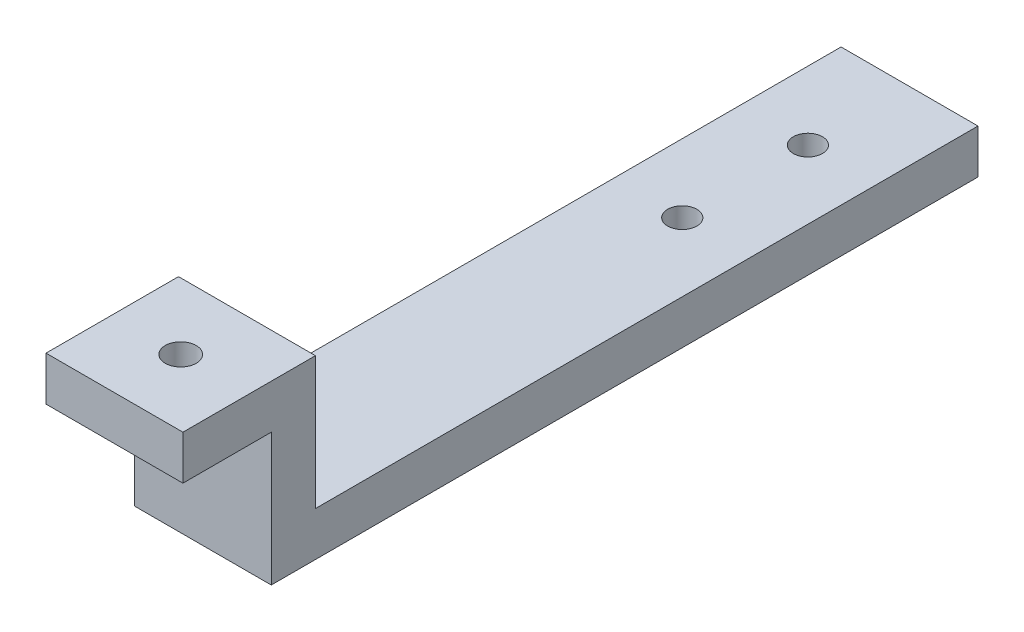
ISO-10303-21;
HEADER;
FILE_DESCRIPTION(('STEP AP214'),'2;1');
FILE_NAME('part.step','',(''),(''),'','','');
FILE_SCHEMA(('AUTOMOTIVE_DESIGN { 1 0 10303 214 1 1 1 1 }'));
ENDSEC;
DATA;
#1=APPLICATION_CONTEXT('core data for automotive mechanical design processes');
#2=APPLICATION_PROTOCOL_DEFINITION('international standard','automotive_design',2000,#1);
#3=PRODUCT_CONTEXT('',#1,'mechanical');
#4=PRODUCT('Part','Part','',(#3));
#5=PRODUCT_RELATED_PRODUCT_CATEGORY('part','',(#4));
#6=PRODUCT_DEFINITION_FORMATION('','',#4);
#7=PRODUCT_DEFINITION_CONTEXT('part definition',#1,'design');
#8=PRODUCT_DEFINITION('design','',#6,#7);
#9=PRODUCT_DEFINITION_SHAPE('','',#8);
#10=(LENGTH_UNIT() NAMED_UNIT(*) SI_UNIT(.MILLI.,.METRE.));
#11=(NAMED_UNIT(*) PLANE_ANGLE_UNIT() SI_UNIT($,.RADIAN.));
#12=(NAMED_UNIT(*) SI_UNIT($,.STERADIAN.) SOLID_ANGLE_UNIT());
#13=UNCERTAINTY_MEASURE_WITH_UNIT(LENGTH_MEASURE(1.E-05),#10,'distance_accuracy_value','');
#14=(GEOMETRIC_REPRESENTATION_CONTEXT(3) GLOBAL_UNCERTAINTY_ASSIGNED_CONTEXT((#13)) GLOBAL_UNIT_ASSIGNED_CONTEXT((#10,
#11,#12)) REPRESENTATION_CONTEXT('',''));
#15=CARTESIAN_POINT('',(0.,0.,0.));
#16=DIRECTION('',(0.,0.,1.));
#17=DIRECTION('',(1.,0.,0.));
#18=AXIS2_PLACEMENT_3D('',#15,#16,#17);
#19=CARTESIAN_POINT('',(31.,-39.9719999999999,-30.));
#20=DIRECTION('',(0.,1.,0.));
#21=DIRECTION('',(0.,0.,1.));
#22=AXIS2_PLACEMENT_3D('',#19,#20,#21);
#23=PLANE('',#22);
#24=CARTESIAN_POINT('',(15.494,-39.9719999999999,-128.552));
#25=DIRECTION('',(0.,1.,0.));
#26=DIRECTION('',(0.,0.,1.));
#27=AXIS2_PLACEMENT_3D('',#24,#25,#26);
#28=CIRCLE('',#27,3.302);
#29=CARTESIAN_POINT('',(15.494,-39.9719999999999,-125.25));
#30=VERTEX_POINT('',#29);
#31=EDGE_CURVE('E40',#30,#30,#28,.T.);
#32=ORIENTED_EDGE('',*,*,#31,.T.);
#33=EDGE_LOOP('',(#32));
#34=FACE_BOUND('',#33,.T.);
#35=CARTESIAN_POINT('',(15.494,-39.9720000000001,-157.));
#36=DIRECTION('',(0.,1.,0.));
#37=DIRECTION('',(0.,0.,1.));
#38=AXIS2_PLACEMENT_3D('',#35,#36,#37);
#39=CIRCLE('',#38,3.30199999999998);
#40=CARTESIAN_POINT('',(15.494,-39.9720000000001,-153.698));
#41=VERTEX_POINT('',#40);
#42=EDGE_CURVE('E187',#41,#41,#39,.T.);
#43=ORIENTED_EDGE('',*,*,#42,.T.);
#44=EDGE_LOOP('',(#43));
#45=FACE_BOUND('',#44,.T.);
#46=DIRECTION('',(0.,0.,-1.));
#47=VECTOR('',#46,1.);
#48=CARTESIAN_POINT('',(0.,-39.9719999999999,-30.));
#49=LINE('',#48,#47);
#50=CARTESIAN_POINT('',(0.,-39.9719999999999,-20.));
#51=VERTEX_POINT('',#50);
#52=CARTESIAN_POINT('',(0.,-39.9720000000001,-180.));
#53=VERTEX_POINT('',#52);
#54=EDGE_CURVE('E135',#51,#53,#49,.T.);
#55=ORIENTED_EDGE('',*,*,#54,.T.);
#56=DIRECTION('',(-1.,0.,0.));
#57=VECTOR('',#56,1.);
#58=CARTESIAN_POINT('',(31.,-39.9720000000001,-180.));
#59=LINE('',#58,#57);
#60=CARTESIAN_POINT('',(31.,-39.9720000000001,-180.));
#61=VERTEX_POINT('',#60);
#62=EDGE_CURVE('E11',#61,#53,#59,.T.);
#63=ORIENTED_EDGE('',*,*,#62,.F.);
#64=DIRECTION('',(0.,0.,-1.));
#65=VECTOR('',#64,1.);
#66=CARTESIAN_POINT('',(31.,-39.9719999999999,-30.));
#67=LINE('',#66,#65);
#68=CARTESIAN_POINT('',(31.,-39.9719999999999,-20.));
#69=VERTEX_POINT('',#68);
#70=EDGE_CURVE('E93',#69,#61,#67,.T.);
#71=ORIENTED_EDGE('',*,*,#70,.F.);
#72=DIRECTION('',(-1.,0.,0.));
#73=VECTOR('',#72,1.);
#74=CARTESIAN_POINT('',(31.,-39.9719999999999,-20.));
#75=LINE('',#74,#73);
#76=EDGE_CURVE('E134',#69,#51,#75,.T.);
#77=ORIENTED_EDGE('',*,*,#76,.T.);
#78=EDGE_LOOP('',(#55,#63,#71,#77));
#79=FACE_BOUND('',#78,.T.);
#80=ADVANCED_FACE('F37',(#34,#45,#79),#23,.F.);
#81=CARTESIAN_POINT('',(31.,-29.9720000000001,-180.));
#82=DIRECTION('',(0.,0.,-1.));
#83=DIRECTION('',(-1.,0.,0.));
#84=AXIS2_PLACEMENT_3D('',#81,#82,#83);
#85=PLANE('',#84);
#86=DIRECTION('',(0.,-1.,0.));
#87=VECTOR('',#86,1.);
#88=CARTESIAN_POINT('',(0.,-29.9720000000001,-180.));
#89=LINE('',#88,#87);
#90=CARTESIAN_POINT('',(0.,-29.9720000000001,-180.));
#91=VERTEX_POINT('',#90);
#92=EDGE_CURVE('E138',#91,#53,#89,.T.);
#93=ORIENTED_EDGE('',*,*,#92,.F.);
#94=DIRECTION('',(-1.,0.,0.));
#95=VECTOR('',#94,1.);
#96=CARTESIAN_POINT('',(31.,-29.9720000000001,-180.));
#97=LINE('',#96,#95);
#98=CARTESIAN_POINT('',(31.,-29.9720000000001,-180.));
#99=VERTEX_POINT('',#98);
#100=EDGE_CURVE('E46',#99,#91,#97,.T.);
#101=ORIENTED_EDGE('',*,*,#100,.F.);
#102=DIRECTION('',(0.,-1.,0.));
#103=VECTOR('',#102,1.);
#104=CARTESIAN_POINT('',(31.,-29.9720000000001,-180.));
#105=LINE('',#104,#103);
#106=EDGE_CURVE('E179',#99,#61,#105,.T.);
#107=ORIENTED_EDGE('',*,*,#106,.T.);
#108=ORIENTED_EDGE('',*,*,#62,.T.);
#109=EDGE_LOOP('',(#93,#101,#107,#108));
#110=FACE_BOUND('',#109,.T.);
#111=ADVANCED_FACE('F170',(#110),#85,.T.);
#112=CARTESIAN_POINT('',(31.,-29.9720000000001,-30.));
#113=DIRECTION('',(0.,1.,0.));
#114=DIRECTION('',(0.,0.,1.));
#115=AXIS2_PLACEMENT_3D('',#112,#113,#114);
#116=PLANE('',#115);
#117=CARTESIAN_POINT('',(15.494,-29.9720000000001,-128.552));
#118=DIRECTION('',(0.,1.,0.));
#119=DIRECTION('',(0.,0.,1.));
#120=AXIS2_PLACEMENT_3D('',#117,#118,#119);
#121=CIRCLE('',#120,3.302);
#122=CARTESIAN_POINT('',(15.494,-29.9720000000001,-125.25));
#123=VERTEX_POINT('',#122);
#124=EDGE_CURVE('E195',#123,#123,#121,.T.);
#125=ORIENTED_EDGE('',*,*,#124,.F.);
#126=EDGE_LOOP('',(#125));
#127=FACE_BOUND('',#126,.T.);
#128=CARTESIAN_POINT('',(15.494,-29.9720000000001,-157.));
#129=DIRECTION('',(0.,1.,0.));
#130=DIRECTION('',(0.,0.,1.));
#131=AXIS2_PLACEMENT_3D('',#128,#129,#130);
#132=CIRCLE('',#131,3.30199999999998);
#133=CARTESIAN_POINT('',(15.494,-29.9720000000001,-153.698));
#134=VERTEX_POINT('',#133);
#135=EDGE_CURVE('E192',#134,#134,#132,.T.);
#136=ORIENTED_EDGE('',*,*,#135,.F.);
#137=EDGE_LOOP('',(#136));
#138=FACE_BOUND('',#137,.T.);
#139=DIRECTION('',(0.,0.,-1.));
#140=VECTOR('',#139,1.);
#141=CARTESIAN_POINT('',(0.,-29.9720000000001,-30.));
#142=LINE('',#141,#140);
#143=CARTESIAN_POINT('',(0.,-29.9720000000001,-30.));
#144=VERTEX_POINT('',#143);
#145=EDGE_CURVE('E142',#144,#91,#142,.T.);
#146=ORIENTED_EDGE('',*,*,#145,.F.);
#147=DIRECTION('',(-1.,0.,0.));
#148=VECTOR('',#147,1.);
#149=CARTESIAN_POINT('',(31.,-29.9720000000001,-30.));
#150=LINE('',#149,#148);
#151=CARTESIAN_POINT('',(31.,-29.9720000000001,-30.));
#152=VERTEX_POINT('',#151);
#153=EDGE_CURVE('E159',#152,#144,#150,.T.);
#154=ORIENTED_EDGE('',*,*,#153,.F.);
#155=DIRECTION('',(0.,0.,-1.));
#156=VECTOR('',#155,1.);
#157=CARTESIAN_POINT('',(31.,-29.9720000000001,-30.));
#158=LINE('',#157,#156);
#159=EDGE_CURVE('E167',#152,#99,#158,.T.);
#160=ORIENTED_EDGE('',*,*,#159,.T.);
#161=ORIENTED_EDGE('',*,*,#100,.T.);
#162=EDGE_LOOP('',(#146,#154,#160,#161));
#163=FACE_BOUND('',#162,.T.);
#164=ADVANCED_FACE('F165',(#127,#138,#163),#116,.T.);
#165=CARTESIAN_POINT('',(31.,0.,-30.));
#166=DIRECTION('',(0.,0.,-1.));
#167=DIRECTION('',(-1.,0.,0.));
#168=AXIS2_PLACEMENT_3D('',#165,#166,#167);
#169=PLANE('',#168);
#170=DIRECTION('',(0.,-1.,0.));
#171=VECTOR('',#170,1.);
#172=CARTESIAN_POINT('',(0.,0.,-30.));
#173=LINE('',#172,#171);
#174=CARTESIAN_POINT('',(0.,0.,-30.));
#175=VERTEX_POINT('',#174);
#176=EDGE_CURVE('E145',#175,#144,#173,.T.);
#177=ORIENTED_EDGE('',*,*,#176,.F.);
#178=DIRECTION('',(-1.,0.,0.));
#179=VECTOR('',#178,1.);
#180=CARTESIAN_POINT('',(31.,0.,-30.));
#181=LINE('',#180,#179);
#182=CARTESIAN_POINT('',(31.,0.,-30.));
#183=VERTEX_POINT('',#182);
#184=EDGE_CURVE('E157',#183,#175,#181,.T.);
#185=ORIENTED_EDGE('',*,*,#184,.F.);
#186=DIRECTION('',(0.,-1.,0.));
#187=VECTOR('',#186,1.);
#188=CARTESIAN_POINT('',(31.,0.,-30.));
#189=LINE('',#188,#187);
#190=EDGE_CURVE('E129',#183,#152,#189,.T.);
#191=ORIENTED_EDGE('',*,*,#190,.T.);
#192=ORIENTED_EDGE('',*,*,#153,.T.);
#193=EDGE_LOOP('',(#177,#185,#191,#192));
#194=FACE_BOUND('',#193,.T.);
#195=ADVANCED_FACE('F177',(#194),#169,.T.);
#196=CARTESIAN_POINT('',(31.,0.,0.));
#197=DIRECTION('',(0.,1.,0.));
#198=DIRECTION('',(0.,0.,1.));
#199=AXIS2_PLACEMENT_3D('',#196,#197,#198);
#200=PLANE('',#199);
#201=CARTESIAN_POINT('',(15.5,0.,-15.));
#202=DIRECTION('',(0.,1.,0.));
#203=DIRECTION('',(0.,0.,1.));
#204=AXIS2_PLACEMENT_3D('',#201,#202,#203);
#205=CIRCLE('',#204,3.5);
#206=CARTESIAN_POINT('',(15.5,0.,-11.5));
#207=VERTEX_POINT('',#206);
#208=EDGE_CURVE('E184',#207,#207,#205,.T.);
#209=ORIENTED_EDGE('',*,*,#208,.F.);
#210=EDGE_LOOP('',(#209));
#211=FACE_BOUND('',#210,.T.);
#212=DIRECTION('',(0.,0.,-1.));
#213=VECTOR('',#212,1.);
#214=CARTESIAN_POINT('',(0.,0.,0.));
#215=LINE('',#214,#213);
#216=CARTESIAN_POINT('',(0.,0.,0.));
#217=VERTEX_POINT('',#216);
#218=EDGE_CURVE('E148',#217,#175,#215,.T.);
#219=ORIENTED_EDGE('',*,*,#218,.F.);
#220=DIRECTION('',(-1.,0.,0.));
#221=VECTOR('',#220,1.);
#222=CARTESIAN_POINT('',(31.,0.,0.));
#223=LINE('',#222,#221);
#224=CARTESIAN_POINT('',(31.,0.,0.));
#225=VERTEX_POINT('',#224);
#226=EDGE_CURVE('E117',#225,#217,#223,.T.);
#227=ORIENTED_EDGE('',*,*,#226,.F.);
#228=DIRECTION('',(0.,0.,-1.));
#229=VECTOR('',#228,1.);
#230=CARTESIAN_POINT('',(31.,0.,0.));
#231=LINE('',#230,#229);
#232=EDGE_CURVE('E127',#225,#183,#231,.T.);
#233=ORIENTED_EDGE('',*,*,#232,.T.);
#234=ORIENTED_EDGE('',*,*,#184,.T.);
#235=EDGE_LOOP('',(#219,#227,#233,#234));
#236=FACE_BOUND('',#235,.T.);
#237=ADVANCED_FACE('F227',(#211,#236),#200,.T.);
#238=CARTESIAN_POINT('',(31.,-10.,0.));
#239=DIRECTION('',(0.,0.,1.));
#240=DIRECTION('',(1.,0.,0.));
#241=AXIS2_PLACEMENT_3D('',#238,#239,#240);
#242=PLANE('',#241);
#243=DIRECTION('',(0.,1.,0.));
#244=VECTOR('',#243,1.);
#245=CARTESIAN_POINT('',(0.,-10.,0.));
#246=LINE('',#245,#244);
#247=CARTESIAN_POINT('',(0.,-10.,0.));
#248=VERTEX_POINT('',#247);
#249=EDGE_CURVE('E116',#248,#217,#246,.T.);
#250=ORIENTED_EDGE('',*,*,#249,.F.);
#251=DIRECTION('',(-1.,0.,0.));
#252=VECTOR('',#251,1.);
#253=CARTESIAN_POINT('',(31.,-10.,0.));
#254=LINE('',#253,#252);
#255=CARTESIAN_POINT('',(31.,-10.,0.));
#256=VERTEX_POINT('',#255);
#257=EDGE_CURVE('E110',#256,#248,#254,.T.);
#258=ORIENTED_EDGE('',*,*,#257,.F.);
#259=DIRECTION('',(0.,1.,0.));
#260=VECTOR('',#259,1.);
#261=CARTESIAN_POINT('',(31.,-10.,0.));
#262=LINE('',#261,#260);
#263=EDGE_CURVE('E114',#256,#225,#262,.T.);
#264=ORIENTED_EDGE('',*,*,#263,.T.);
#265=ORIENTED_EDGE('',*,*,#226,.T.);
#266=EDGE_LOOP('',(#250,#258,#264,#265));
#267=FACE_BOUND('',#266,.T.);
#268=ADVANCED_FACE('F112',(#267),#242,.T.);
#269=CARTESIAN_POINT('',(31.,-10.,0.));
#270=DIRECTION('',(0.,1.,0.));
#271=DIRECTION('',(0.,0.,1.));
#272=AXIS2_PLACEMENT_3D('',#269,#270,#271);
#273=PLANE('',#272);
#274=CARTESIAN_POINT('',(15.5,-10.,-15.));
#275=DIRECTION('',(0.,1.,0.));
#276=DIRECTION('',(0.,0.,1.));
#277=AXIS2_PLACEMENT_3D('',#274,#275,#276);
#278=CIRCLE('',#277,3.5);
#279=CARTESIAN_POINT('',(15.5,-10.,-11.5));
#280=VERTEX_POINT('',#279);
#281=EDGE_CURVE('E139',#280,#280,#278,.T.);
#282=ORIENTED_EDGE('',*,*,#281,.T.);
#283=EDGE_LOOP('',(#282));
#284=FACE_BOUND('',#283,.T.);
#285=DIRECTION('',(0.,0.,-1.));
#286=VECTOR('',#285,1.);
#287=CARTESIAN_POINT('',(0.,-10.,0.));
#288=LINE('',#287,#286);
#289=CARTESIAN_POINT('',(0.,-10.,-20.));
#290=VERTEX_POINT('',#289);
#291=EDGE_CURVE('E81',#248,#290,#288,.T.);
#292=ORIENTED_EDGE('',*,*,#291,.T.);
#293=DIRECTION('',(-1.,0.,0.));
#294=VECTOR('',#293,1.);
#295=CARTESIAN_POINT('',(31.,-10.,-20.));
#296=LINE('',#295,#294);
#297=CARTESIAN_POINT('',(31.,-10.,-20.));
#298=VERTEX_POINT('',#297);
#299=EDGE_CURVE('E118',#298,#290,#296,.T.);
#300=ORIENTED_EDGE('',*,*,#299,.F.);
#301=DIRECTION('',(0.,0.,-1.));
#302=VECTOR('',#301,1.);
#303=CARTESIAN_POINT('',(31.,-10.,0.));
#304=LINE('',#303,#302);
#305=EDGE_CURVE('E120',#256,#298,#304,.T.);
#306=ORIENTED_EDGE('',*,*,#305,.F.);
#307=ORIENTED_EDGE('',*,*,#257,.T.);
#308=EDGE_LOOP('',(#292,#300,#306,#307));
#309=FACE_BOUND('',#308,.T.);
#310=ADVANCED_FACE('F121',(#284,#309),#273,.F.);
#311=CARTESIAN_POINT('',(31.,0.,-20.));
#312=DIRECTION('',(0.,0.,-1.));
#313=DIRECTION('',(-1.,0.,0.));
#314=AXIS2_PLACEMENT_3D('',#311,#312,#313);
#315=PLANE('',#314);
#316=DIRECTION('',(0.,1.,0.));
#317=VECTOR('',#316,1.);
#318=CARTESIAN_POINT('',(0.,0.,-20.));
#319=LINE('',#318,#317);
#320=EDGE_CURVE('E87',#290,#51,#319,.F.);
#321=ORIENTED_EDGE('',*,*,#320,.T.);
#322=ORIENTED_EDGE('',*,*,#76,.F.);
#323=DIRECTION('',(0.,1.,0.));
#324=VECTOR('',#323,1.);
#325=CARTESIAN_POINT('',(31.,0.,-20.));
#326=LINE('',#325,#324);
#327=EDGE_CURVE('E54',#298,#69,#326,.F.);
#328=ORIENTED_EDGE('',*,*,#327,.F.);
#329=ORIENTED_EDGE('',*,*,#299,.T.);
#330=EDGE_LOOP('',(#321,#322,#328,#329));
#331=FACE_BOUND('',#330,.T.);
#332=ADVANCED_FACE('F235',(#331),#315,.F.);
#333=CARTESIAN_POINT('',(31.,0.,0.));
#334=DIRECTION('',(-1.,0.,0.));
#335=DIRECTION('',(0.,0.,1.));
#336=AXIS2_PLACEMENT_3D('',#333,#334,#335);
#337=PLANE('',#336);
#338=ORIENTED_EDGE('',*,*,#70,.T.);
#339=ORIENTED_EDGE('',*,*,#106,.F.);
#340=ORIENTED_EDGE('',*,*,#159,.F.);
#341=ORIENTED_EDGE('',*,*,#190,.F.);
#342=ORIENTED_EDGE('',*,*,#232,.F.);
#343=ORIENTED_EDGE('',*,*,#263,.F.);
#344=ORIENTED_EDGE('',*,*,#305,.T.);
#345=ORIENTED_EDGE('',*,*,#327,.T.);
#346=EDGE_LOOP('',(#338,#339,#340,#341,#342,#343,#344,#345));
#347=FACE_BOUND('',#346,.T.);
#348=ADVANCED_FACE('F124',(#347),#337,.F.);
#349=CARTESIAN_POINT('',(0.,0.,0.));
#350=DIRECTION('',(-1.,0.,0.));
#351=DIRECTION('',(0.,0.,1.));
#352=AXIS2_PLACEMENT_3D('',#349,#350,#351);
#353=PLANE('',#352);
#354=ORIENTED_EDGE('',*,*,#54,.F.);
#355=ORIENTED_EDGE('',*,*,#320,.F.);
#356=ORIENTED_EDGE('',*,*,#291,.F.);
#357=ORIENTED_EDGE('',*,*,#249,.T.);
#358=ORIENTED_EDGE('',*,*,#218,.T.);
#359=ORIENTED_EDGE('',*,*,#176,.T.);
#360=ORIENTED_EDGE('',*,*,#145,.T.);
#361=ORIENTED_EDGE('',*,*,#92,.T.);
#362=EDGE_LOOP('',(#354,#355,#356,#357,#358,#359,#360,#361));
#363=FACE_BOUND('',#362,.T.);
#364=ADVANCED_FACE('F173',(#363),#353,.T.);
#365=CARTESIAN_POINT('',(15.5,-10.,-15.));
#366=DIRECTION('',(0.,1.,0.));
#367=DIRECTION('',(0.,0.,1.));
#368=AXIS2_PLACEMENT_3D('',#365,#366,#367);
#369=CYLINDRICAL_SURFACE('',#368,3.5);
#370=ORIENTED_EDGE('',*,*,#281,.F.);
#371=EDGE_LOOP('',(#370));
#372=FACE_BOUND('',#371,.T.);
#373=ORIENTED_EDGE('',*,*,#208,.T.);
#374=EDGE_LOOP('',(#373));
#375=FACE_BOUND('',#374,.T.);
#376=ADVANCED_FACE('F212',(#372,#375),#369,.F.);
#377=CARTESIAN_POINT('',(15.494,-40.1320000000001,-157.));
#378=DIRECTION('',(0.,1.,0.));
#379=DIRECTION('',(0.,0.,1.));
#380=AXIS2_PLACEMENT_3D('',#377,#378,#379);
#381=CYLINDRICAL_SURFACE('',#380,3.30199999999998);
#382=ORIENTED_EDGE('',*,*,#135,.T.);
#383=EDGE_LOOP('',(#382));
#384=FACE_BOUND('',#383,.T.);
#385=ORIENTED_EDGE('',*,*,#42,.F.);
#386=EDGE_LOOP('',(#385));
#387=FACE_BOUND('',#386,.T.);
#388=ADVANCED_FACE('F206',(#384,#387),#381,.F.);
#389=CARTESIAN_POINT('',(15.494,-29.9720000000001,-128.552));
#390=DIRECTION('',(0.,1.,0.));
#391=DIRECTION('',(0.,0.,1.));
#392=AXIS2_PLACEMENT_3D('',#389,#390,#391);
#393=CYLINDRICAL_SURFACE('',#392,3.302);
#394=ORIENTED_EDGE('',*,*,#124,.T.);
#395=EDGE_LOOP('',(#394));
#396=FACE_BOUND('',#395,.T.);
#397=ORIENTED_EDGE('',*,*,#31,.F.);
#398=EDGE_LOOP('',(#397));
#399=FACE_BOUND('',#398,.T.);
#400=ADVANCED_FACE('F204',(#396,#399),#393,.F.);
#401=CLOSED_SHELL('',(#80,#111,#164,#195,#237,#268,#310,#332,#348,#364,#376,#388,#400));
#402=MANIFOLD_SOLID_BREP('B2',#401);
#403=ADVANCED_BREP_SHAPE_REPRESENTATION('',(#18,#402),#14);
#404=SHAPE_DEFINITION_REPRESENTATION(#9,#403);
ENDSEC;
END-ISO-10303-21;
